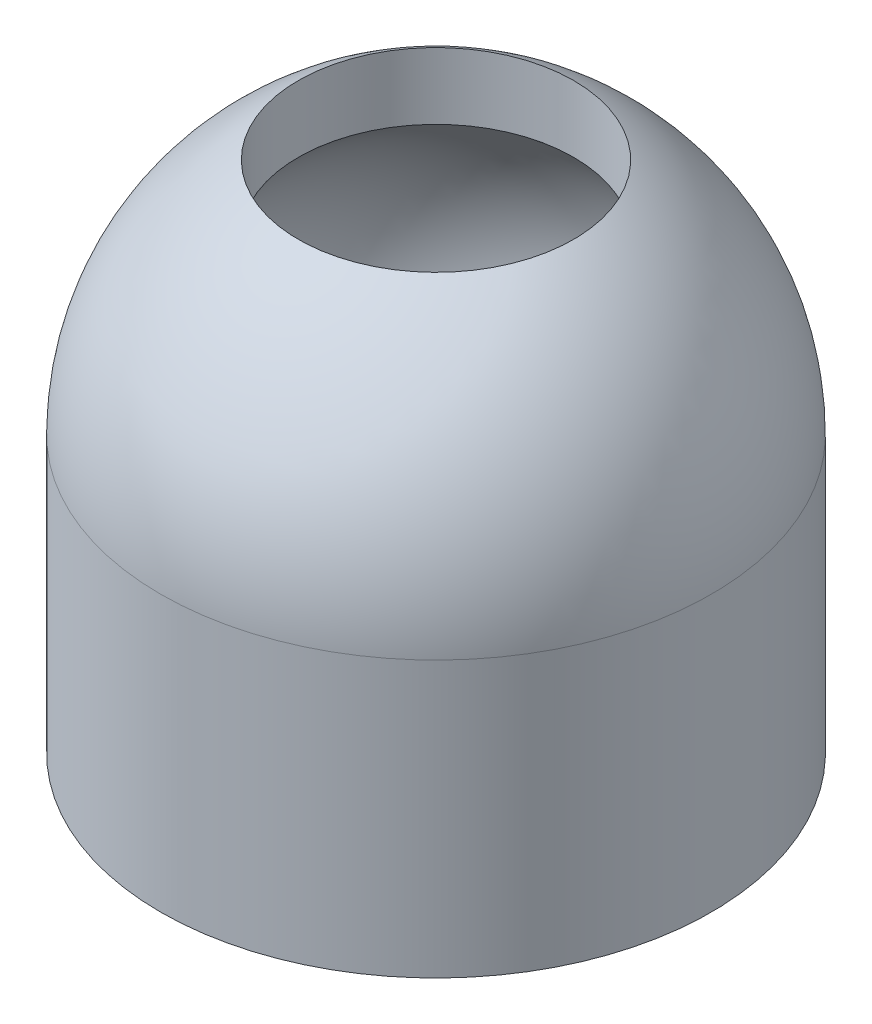
ISO-10303-21;
HEADER;
FILE_DESCRIPTION(('STEP AP214'),'2;1');
FILE_NAME('part.step','',(''),(''),'','','');
FILE_SCHEMA(('AUTOMOTIVE_DESIGN { 1 0 10303 214 1 1 1 1 }'));
ENDSEC;
DATA;
#1=APPLICATION_CONTEXT('core data for automotive mechanical design processes');
#2=APPLICATION_PROTOCOL_DEFINITION('international standard','automotive_design',2000,#1);
#3=PRODUCT_CONTEXT('',#1,'mechanical');
#4=PRODUCT('Part','Part','',(#3));
#5=PRODUCT_RELATED_PRODUCT_CATEGORY('part','',(#4));
#6=PRODUCT_DEFINITION_FORMATION('','',#4);
#7=PRODUCT_DEFINITION_CONTEXT('part definition',#1,'design');
#8=PRODUCT_DEFINITION('design','',#6,#7);
#9=PRODUCT_DEFINITION_SHAPE('','',#8);
#10=(LENGTH_UNIT() NAMED_UNIT(*) SI_UNIT(.MILLI.,.METRE.));
#11=(NAMED_UNIT(*) PLANE_ANGLE_UNIT() SI_UNIT($,.RADIAN.));
#12=(NAMED_UNIT(*) SI_UNIT($,.STERADIAN.) SOLID_ANGLE_UNIT());
#13=UNCERTAINTY_MEASURE_WITH_UNIT(LENGTH_MEASURE(1.E-05),#10,'distance_accuracy_value','');
#14=(GEOMETRIC_REPRESENTATION_CONTEXT(3) GLOBAL_UNCERTAINTY_ASSIGNED_CONTEXT((#13)) GLOBAL_UNIT_ASSIGNED_CONTEXT((#10,
#11,#12)) REPRESENTATION_CONTEXT('',''));
#15=CARTESIAN_POINT('',(0.,0.,0.));
#16=DIRECTION('',(0.,0.,1.));
#17=DIRECTION('',(1.,0.,0.));
#18=AXIS2_PLACEMENT_3D('',#15,#16,#17);
#19=CARTESIAN_POINT('',(0.,0.,0.));
#20=DIRECTION('',(0.,1.,0.));
#21=DIRECTION('',(1.,0.,0.));
#22=AXIS2_PLACEMENT_3D('',#19,#20,#21);
#23=SPHERICAL_SURFACE('',#22,5.);
#24=CARTESIAN_POINT('',(0.,4.33012701892219,0.));
#25=DIRECTION('',(0.,-1.,0.));
#26=DIRECTION('',(0.,0.,-1.));
#27=AXIS2_PLACEMENT_3D('',#24,#25,#26);
#28=CIRCLE('',#27,2.5);
#29=CARTESIAN_POINT('',(0.,4.33012701892219,-2.5));
#30=VERTEX_POINT('',#29);
#31=EDGE_CURVE('E42',#30,#30,#28,.T.);
#32=ORIENTED_EDGE('',*,*,#31,.T.);
#33=EDGE_LOOP('',(#32));
#34=FACE_BOUND('',#33,.T.);
#35=CARTESIAN_POINT('',(0.,0.,0.));
#36=DIRECTION('',(0.,1.,0.));
#37=DIRECTION('',(0.,0.,1.));
#38=AXIS2_PLACEMENT_3D('',#35,#36,#37);
#39=CIRCLE('',#38,5.);
#40=CARTESIAN_POINT('',(0.,0.,5.));
#41=VERTEX_POINT('',#40);
#42=EDGE_CURVE('E38',#41,#41,#39,.T.);
#43=ORIENTED_EDGE('',*,*,#42,.T.);
#44=EDGE_LOOP('',(#43));
#45=FACE_BOUND('',#44,.T.);
#46=ADVANCED_FACE('F31',(#34,#45),#23,.T.);
#47=CARTESIAN_POINT('',(0.,-5.,0.));
#48=DIRECTION('',(0.,-1.,0.));
#49=DIRECTION('',(0.,0.,-1.));
#50=AXIS2_PLACEMENT_3D('',#47,#48,#49);
#51=PLANE('',#50);
#52=CARTESIAN_POINT('',(0.,-5.,0.));
#53=DIRECTION('',(0.,1.,0.));
#54=DIRECTION('',(0.,0.,1.));
#55=AXIS2_PLACEMENT_3D('',#52,#53,#54);
#56=CIRCLE('',#55,5.);
#57=CARTESIAN_POINT('',(0.,-5.,5.));
#58=VERTEX_POINT('',#57);
#59=EDGE_CURVE('E10',#58,#58,#56,.T.);
#60=ORIENTED_EDGE('',*,*,#59,.F.);
#61=EDGE_LOOP('',(#60));
#62=FACE_BOUND('',#61,.T.);
#63=ADVANCED_FACE('F64',(#62),#51,.T.);
#64=CARTESIAN_POINT('',(0.,5.,0.));
#65=DIRECTION('',(0.,1.,0.));
#66=DIRECTION('',(0.,0.,1.));
#67=AXIS2_PLACEMENT_3D('',#64,#65,#66);
#68=CYLINDRICAL_SURFACE('',#67,5.);
#69=ORIENTED_EDGE('',*,*,#59,.T.);
#70=EDGE_LOOP('',(#69));
#71=FACE_BOUND('',#70,.T.);
#72=ORIENTED_EDGE('',*,*,#42,.F.);
#73=EDGE_LOOP('',(#72));
#74=FACE_BOUND('',#73,.T.);
#75=ADVANCED_FACE('F60',(#71,#74),#68,.T.);
#76=CARTESIAN_POINT('',(0.,2.,0.));
#77=DIRECTION('',(0.,1.,0.));
#78=DIRECTION('',(0.,0.,1.));
#79=AXIS2_PLACEMENT_3D('',#76,#77,#78);
#80=CYLINDRICAL_SURFACE('',#79,2.5);
#81=CARTESIAN_POINT('',(0.,3.1224989991992,0.));
#82=DIRECTION('',(0.,-1.,0.));
#83=DIRECTION('',(0.,0.,-1.));
#84=AXIS2_PLACEMENT_3D('',#81,#82,#83);
#85=CIRCLE('',#84,2.5);
#86=CARTESIAN_POINT('',(0.,3.1224989991992,-2.5));
#87=VERTEX_POINT('',#86);
#88=EDGE_CURVE('E34',#87,#87,#85,.T.);
#89=ORIENTED_EDGE('',*,*,#88,.T.);
#90=EDGE_LOOP('',(#89));
#91=FACE_BOUND('',#90,.T.);
#92=ORIENTED_EDGE('',*,*,#31,.F.);
#93=EDGE_LOOP('',(#92));
#94=FACE_BOUND('',#93,.T.);
#95=ADVANCED_FACE('F51',(#91,#94),#80,.F.);
#96=CARTESIAN_POINT('',(0.,0.,0.));
#97=DIRECTION('',(0.,1.,0.));
#98=DIRECTION('',(1.,0.,0.));
#99=AXIS2_PLACEMENT_3D('',#96,#97,#98);
#100=SPHERICAL_SURFACE('',#99,4.);
#101=ORIENTED_EDGE('',*,*,#88,.F.);
#102=EDGE_LOOP('',(#101));
#103=FACE_BOUND('',#102,.T.);
#104=ADVANCED_FACE('F54',(#103),#100,.F.);
#105=CLOSED_SHELL('',(#46,#63,#75,#95,#104));
#106=MANIFOLD_SOLID_BREP('B2',#105);
#107=ADVANCED_BREP_SHAPE_REPRESENTATION('',(#18,#106),#14);
#108=SHAPE_DEFINITION_REPRESENTATION(#9,#107);
ENDSEC;
END-ISO-10303-21;
